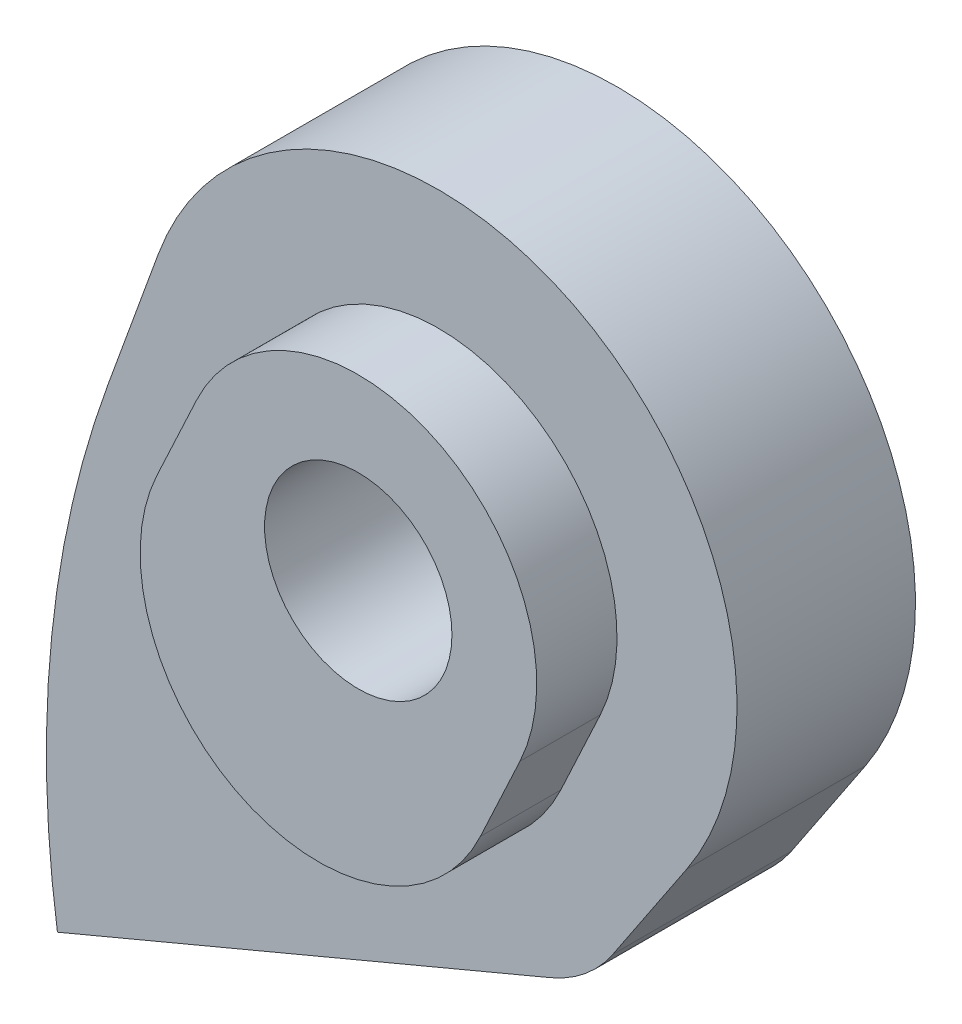
ISO-10303-21;
HEADER;
FILE_DESCRIPTION(('STEP AP214'),'2;1');
FILE_NAME('part.step','',(''),(''),'','','');
FILE_SCHEMA(('AUTOMOTIVE_DESIGN { 1 0 10303 214 1 1 1 1 }'));
ENDSEC;
DATA;
#1=APPLICATION_CONTEXT('core data for automotive mechanical design processes');
#2=APPLICATION_PROTOCOL_DEFINITION('international standard','automotive_design',2000,#1);
#3=PRODUCT_CONTEXT('',#1,'mechanical');
#4=PRODUCT('Part','Part','',(#3));
#5=PRODUCT_RELATED_PRODUCT_CATEGORY('part','',(#4));
#6=PRODUCT_DEFINITION_FORMATION('','',#4);
#7=PRODUCT_DEFINITION_CONTEXT('part definition',#1,'design');
#8=PRODUCT_DEFINITION('design','',#6,#7);
#9=PRODUCT_DEFINITION_SHAPE('','',#8);
#10=(LENGTH_UNIT() NAMED_UNIT(*) SI_UNIT(.MILLI.,.METRE.));
#11=(NAMED_UNIT(*) PLANE_ANGLE_UNIT() SI_UNIT($,.RADIAN.));
#12=(NAMED_UNIT(*) SI_UNIT($,.STERADIAN.) SOLID_ANGLE_UNIT());
#13=UNCERTAINTY_MEASURE_WITH_UNIT(LENGTH_MEASURE(1.E-05),#10,'distance_accuracy_value','');
#14=(GEOMETRIC_REPRESENTATION_CONTEXT(3) GLOBAL_UNCERTAINTY_ASSIGNED_CONTEXT((#13)) GLOBAL_UNIT_ASSIGNED_CONTEXT((#10,
#11,#12)) REPRESENTATION_CONTEXT('',''));
#15=CARTESIAN_POINT('',(0.,0.,0.));
#16=DIRECTION('',(0.,0.,1.));
#17=DIRECTION('',(1.,0.,0.));
#18=AXIS2_PLACEMENT_3D('',#15,#16,#17);
#19=CARTESIAN_POINT('',(0.11468761398859,80.1325343968941,0.));
#20=DIRECTION('',(0.,0.,1.));
#21=DIRECTION('',(1.,0.,0.));
#22=AXIS2_PLACEMENT_3D('',#19,#20,#21);
#23=PLANE('',#22);
#24=CARTESIAN_POINT('',(14.2795120747355,71.4970986035797,0.));
#25=DIRECTION('',(0.,0.,1.));
#26=DIRECTION('',(1.,0.,0.));
#27=AXIS2_PLACEMENT_3D('',#24,#25,#26);
#28=CIRCLE('',#27,22.9540740082007);
#29=CARTESIAN_POINT('',(-7.29026188774433,79.3478542857725,0.));
#30=VERTEX_POINT('',#29);
#31=CARTESIAN_POINT('',(-8.42769677737512,68.1396919078421,0.));
#32=VERTEX_POINT('',#31);
#33=EDGE_CURVE('E154',#30,#32,#28,.T.);
#34=ORIENTED_EDGE('',*,*,#33,.T.);
#35=DIRECTION('',(-0.921960246209325,-0.387284526426812,0.));
#36=VECTOR('',#35,1.);
#37=CARTESIAN_POINT('',(2.62584420432856,72.7829131335289,0.));
#38=LINE('',#37,#36);
#39=CARTESIAN_POINT('',(2.62584420432857,72.7829131335288,0.));
#40=VERTEX_POINT('',#39);
#41=EDGE_CURVE('E178',#40,#32,#38,.T.);
#42=ORIENTED_EDGE('',*,*,#41,.F.);
#43=CARTESIAN_POINT('',(1.41064938117233,75.6757767567832,0.));
#44=DIRECTION('',(0.,0.,-1.));
#45=DIRECTION('',(-1.,0.,0.));
#46=AXIS2_PLACEMENT_3D('',#43,#44,#45);
#47=CIRCLE('',#46,3.13773140994799);
#48=CARTESIAN_POINT('',(4.02035151590427,73.933705240183,0.));
#49=VERTEX_POINT('',#48);
#50=EDGE_CURVE('E173',#49,#40,#47,.T.);
#51=ORIENTED_EDGE('',*,*,#50,.F.);
#52=DIRECTION('',(0.555200968150768,0.831716228628761,0.));
#53=VECTOR('',#52,1.);
#54=CARTESIAN_POINT('',(4.02035151590429,73.933705240183,0.));
#55=LINE('',#54,#53);
#56=CARTESIAN_POINT('',(5.67886918351501,76.4182399199654,0.));
#57=VERTEX_POINT('',#56);
#58=EDGE_CURVE('E147',#49,#57,#55,.T.);
#59=ORIENTED_EDGE('',*,*,#58,.T.);
#60=CARTESIAN_POINT('',(0.11468761398859,80.1325343968941,0.));
#61=DIRECTION('',(0.,0.,1.));
#62=DIRECTION('',(1.,0.,0.));
#63=AXIS2_PLACEMENT_3D('',#60,#61,#62);
#64=CIRCLE('',#63,6.69000000000006);
#65=CARTESIAN_POINT('',(-6.17185601906935,82.4206491557424,0.));
#66=VERTEX_POINT('',#65);
#67=EDGE_CURVE('E149',#57,#66,#64,.T.);
#68=ORIENTED_EDGE('',*,*,#67,.T.);
#69=DIRECTION('',(-0.342020143325666,-0.939692620785909,0.));
#70=VECTOR('',#69,1.);
#71=CARTESIAN_POINT('',(-6.1718560190694,82.4206491557424,0.));
#72=LINE('',#71,#70);
#73=EDGE_CURVE('E155',#66,#30,#72,.T.);
#74=ORIENTED_EDGE('',*,*,#73,.T.);
#75=EDGE_LOOP('',(#34,#42,#51,#59,#68,#74));
#76=FACE_BOUND('',#75,.T.);
#77=DIRECTION('',(-0.4226182617407,-0.90630778703665,0.));
#78=VECTOR('',#77,1.);
#79=CARTESIAN_POINT('',(-3.51054353415801,81.8230074438569,0.));
#80=LINE('',#79,#78);
#81=CARTESIAN_POINT('',(-3.51054353415801,81.8230074438569,0.));
#82=VERTEX_POINT('',#81);
#83=CARTESIAN_POINT('',(-4.39804188381347,79.9197610910799,0.));
#84=VERTEX_POINT('',#83);
#85=EDGE_CURVE('E241',#82,#84,#80,.T.);
#86=ORIENTED_EDGE('',*,*,#85,.F.);
#87=CARTESIAN_POINT('',(0.114687613988609,80.1325343968941,0.));
#88=DIRECTION('',(0.,0.,1.));
#89=DIRECTION('',(1.,0.,0.));
#90=AXIS2_PLACEMENT_3D('',#87,#88,#89);
#91=CIRCLE('',#90,4.00000000000001);
#92=CARTESIAN_POINT('',(3.73991876213519,78.4420613499313,0.));
#93=VERTEX_POINT('',#92);
#94=EDGE_CURVE('E145',#93,#82,#91,.T.);
#95=ORIENTED_EDGE('',*,*,#94,.F.);
#96=DIRECTION('',(0.4226182617407,0.90630778703665,0.));
#97=VECTOR('',#96,1.);
#98=CARTESIAN_POINT('',(3.73991876213519,78.4420613499313,0.));
#99=LINE('',#98,#97);
#100=CARTESIAN_POINT('',(2.85242041247973,76.5388149971543,0.));
#101=VERTEX_POINT('',#100);
#102=EDGE_CURVE('E141',#101,#93,#99,.T.);
#103=ORIENTED_EDGE('',*,*,#102,.F.);
#104=CARTESIAN_POINT('',(-0.772810735666862,78.2292880441171,0.));
#105=DIRECTION('',(0.,0.,1.));
#106=DIRECTION('',(1.,0.,0.));
#107=AXIS2_PLACEMENT_3D('',#104,#105,#106);
#108=CIRCLE('',#107,4.00000000000001);
#109=EDGE_CURVE('E243',#84,#101,#108,.T.);
#110=ORIENTED_EDGE('',*,*,#109,.F.);
#111=EDGE_LOOP('',(#86,#95,#103,#110));
#112=FACE_BOUND('',#111,.T.);
#113=ADVANCED_FACE('F33',(#76,#112),#23,.T.);
#114=CARTESIAN_POINT('',(-8.01359795678153,76.9658058271043,-7.));
#115=DIRECTION('',(-0.921960246209324,-0.387284526426815,0.));
#116=DIRECTION('',(0.387284526426815,-0.921960246209324,0.));
#117=AXIS2_PLACEMENT_3D('',#114,#115,#116);
#118=PLANE('',#117);
#119=DIRECTION('',(0.387284526426815,-0.921960246209324,0.));
#120=VECTOR('',#119,1.);
#121=CARTESIAN_POINT('',(-8.01359795678153,76.9658058271043,-4.));
#122=LINE('',#121,#120);
#123=CARTESIAN_POINT('',(-8.01359795678153,76.9658058271043,-4.));
#124=VERTEX_POINT('',#123);
#125=CARTESIAN_POINT('',(-4.92424784177968,69.611373108264,-4.));
#126=VERTEX_POINT('',#125);
#127=EDGE_CURVE('E56',#124,#126,#122,.T.);
#128=ORIENTED_EDGE('',*,*,#127,.T.);
#129=DIRECTION('',(0.,0.,1.));
#130=VECTOR('',#129,1.);
#131=CARTESIAN_POINT('',(-4.92424784177968,69.611373108264,-7.));
#132=LINE('',#131,#130);
#133=CARTESIAN_POINT('',(-4.92424784177968,69.611373108264,-7.));
#134=VERTEX_POINT('',#133);
#135=EDGE_CURVE('E166',#134,#126,#132,.T.);
#136=ORIENTED_EDGE('',*,*,#135,.F.);
#137=DIRECTION('',(0.387284526426815,-0.921960246209324,0.));
#138=VECTOR('',#137,1.);
#139=CARTESIAN_POINT('',(-8.01359795678153,76.9658058271043,-7.));
#140=LINE('',#139,#138);
#141=CARTESIAN_POINT('',(-8.01359795678153,76.9658058271043,-7.));
#142=VERTEX_POINT('',#141);
#143=EDGE_CURVE('E164',#142,#134,#140,.T.);
#144=ORIENTED_EDGE('',*,*,#143,.F.);
#145=DIRECTION('',(0.,0.,1.));
#146=VECTOR('',#145,1.);
#147=CARTESIAN_POINT('',(-8.01359795678153,76.9658058271043,-7.));
#148=LINE('',#147,#146);
#149=EDGE_CURVE('E170',#142,#124,#148,.T.);
#150=ORIENTED_EDGE('',*,*,#149,.T.);
#151=EDGE_LOOP('',(#128,#136,#144,#150));
#152=FACE_BOUND('',#151,.T.);
#153=ADVANCED_FACE('F230',(#152),#118,.F.);
#154=CARTESIAN_POINT('',(14.2795120747355,71.4970986035797,-7.));
#155=DIRECTION('',(0.,0.,1.));
#156=DIRECTION('',(1.,0.,0.));
#157=AXIS2_PLACEMENT_3D('',#154,#155,#156);
#158=PLANE('',#157);
#159=DIRECTION('',(-0.921960246209326,-0.38728452642681,0.));
#160=VECTOR('',#159,1.);
#161=CARTESIAN_POINT('',(-4.92424784177968,69.611373108264,-7.));
#162=LINE('',#161,#160);
#163=CARTESIAN_POINT('',(-8.42769677737511,68.1396919078421,-7.));
#164=VERTEX_POINT('',#163);
#165=EDGE_CURVE('E159',#134,#164,#162,.T.);
#166=ORIENTED_EDGE('',*,*,#165,.T.);
#167=CARTESIAN_POINT('',(14.2795120747355,71.4970986035797,-7.));
#168=DIRECTION('',(0.,0.,-1.));
#169=DIRECTION('',(1.,0.,0.));
#170=AXIS2_PLACEMENT_3D('',#167,#168,#169);
#171=CIRCLE('',#170,22.9540740082007);
#172=EDGE_CURVE('E162',#164,#142,#171,.T.);
#173=ORIENTED_EDGE('',*,*,#172,.T.);
#174=ORIENTED_EDGE('',*,*,#143,.T.);
#175=EDGE_LOOP('',(#166,#173,#174));
#176=FACE_BOUND('',#175,.T.);
#177=ADVANCED_FACE('F281',(#176),#158,.F.);
#178=CARTESIAN_POINT('',(0.11468761398859,80.1325343968941,-4.));
#179=DIRECTION('',(0.,0.,1.));
#180=DIRECTION('',(1.,0.,0.));
#181=AXIS2_PLACEMENT_3D('',#178,#179,#180);
#182=PLANE('',#181);
#183=CARTESIAN_POINT('',(0.11468761398859,80.1325343968941,-4.));
#184=DIRECTION('',(0.,0.,1.));
#185=DIRECTION('',(1.,0.,0.));
#186=AXIS2_PLACEMENT_3D('',#183,#184,#185);
#187=CIRCLE('',#186,2.10000000000001);
#188=CARTESIAN_POINT('',(2.2146876139886,80.1325343968941,-4.));
#189=VERTEX_POINT('',#188);
#190=EDGE_CURVE('E246',#189,#189,#187,.T.);
#191=ORIENTED_EDGE('',*,*,#190,.T.);
#192=EDGE_LOOP('',(#191));
#193=FACE_BOUND('',#192,.T.);
#194=ORIENTED_EDGE('',*,*,#127,.F.);
#195=CARTESIAN_POINT('',(14.2795120747355,71.4970986035797,-4.));
#196=DIRECTION('',(0.,0.,-1.));
#197=DIRECTION('',(-1.,0.,0.));
#198=AXIS2_PLACEMENT_3D('',#195,#196,#197);
#199=CIRCLE('',#198,22.9540740082007);
#200=CARTESIAN_POINT('',(-7.29026188774433,79.3478542857725,-4.));
#201=VERTEX_POINT('',#200);
#202=EDGE_CURVE('E184',#124,#201,#199,.T.);
#203=ORIENTED_EDGE('',*,*,#202,.T.);
#204=DIRECTION('',(0.342020143325687,0.939692620785902,0.));
#205=VECTOR('',#204,1.);
#206=CARTESIAN_POINT('',(-6.17185601906934,82.4206491557424,-4.));
#207=LINE('',#206,#205);
#208=CARTESIAN_POINT('',(-6.17185601906934,82.4206491557424,-4.));
#209=VERTEX_POINT('',#208);
#210=EDGE_CURVE('E186',#201,#209,#207,.T.);
#211=ORIENTED_EDGE('',*,*,#210,.T.);
#212=CARTESIAN_POINT('',(0.11468761398859,80.1325343968941,-4.));
#213=DIRECTION('',(0.,0.,-1.));
#214=DIRECTION('',(1.,0.,0.));
#215=AXIS2_PLACEMENT_3D('',#212,#213,#214);
#216=CIRCLE('',#215,6.69000000000002);
#217=CARTESIAN_POINT('',(5.67886918351501,76.4182399199654,-4.));
#218=VERTEX_POINT('',#217);
#219=EDGE_CURVE('E174',#209,#218,#216,.T.);
#220=ORIENTED_EDGE('',*,*,#219,.T.);
#221=DIRECTION('',(-0.555200968150769,-0.83171622862876,0.));
#222=VECTOR('',#221,1.);
#223=CARTESIAN_POINT('',(5.67886918351501,76.4182399199654,-4.));
#224=LINE('',#223,#222);
#225=CARTESIAN_POINT('',(4.02035151590429,73.933705240183,-4.));
#226=VERTEX_POINT('',#225);
#227=EDGE_CURVE('E177',#218,#226,#224,.T.);
#228=ORIENTED_EDGE('',*,*,#227,.T.);
#229=CARTESIAN_POINT('',(1.41064938117233,75.6757767567832,-4.));
#230=DIRECTION('',(0.,0.,-1.));
#231=DIRECTION('',(-1.,0.,0.));
#232=AXIS2_PLACEMENT_3D('',#229,#230,#231);
#233=CIRCLE('',#232,3.13773140994799);
#234=CARTESIAN_POINT('',(2.62584420432857,72.7829131335288,-4.));
#235=VERTEX_POINT('',#234);
#236=EDGE_CURVE('E180',#226,#235,#233,.T.);
#237=ORIENTED_EDGE('',*,*,#236,.T.);
#238=DIRECTION('',(-0.921960246209325,-0.387284526426812,0.));
#239=VECTOR('',#238,1.);
#240=CARTESIAN_POINT('',(2.62584420432856,72.7829131335289,-4.));
#241=LINE('',#240,#239);
#242=EDGE_CURVE('E182',#235,#126,#241,.T.);
#243=ORIENTED_EDGE('',*,*,#242,.T.);
#244=EDGE_LOOP('',(#194,#203,#211,#220,#228,#237,#243));
#245=FACE_BOUND('',#244,.T.);
#246=ADVANCED_FACE('F212',(#193,#245),#182,.F.);
#247=CARTESIAN_POINT('',(1.41064938117233,75.6757767567832,-4.));
#248=DIRECTION('',(0.,0.,1.));
#249=DIRECTION('',(1.,0.,0.));
#250=AXIS2_PLACEMENT_3D('',#247,#248,#249);
#251=CYLINDRICAL_SURFACE('',#250,3.13773140994799);
#252=ORIENTED_EDGE('',*,*,#50,.T.);
#253=DIRECTION('',(0.,0.,1.));
#254=VECTOR('',#253,1.);
#255=CARTESIAN_POINT('',(2.62584420432857,72.7829131335288,-4.));
#256=LINE('',#255,#254);
#257=EDGE_CURVE('E196',#235,#40,#256,.T.);
#258=ORIENTED_EDGE('',*,*,#257,.F.);
#259=ORIENTED_EDGE('',*,*,#236,.F.);
#260=DIRECTION('',(0.,0.,1.));
#261=VECTOR('',#260,1.);
#262=CARTESIAN_POINT('',(4.02035151590429,73.933705240183,-4.));
#263=LINE('',#262,#261);
#264=EDGE_CURVE('E199',#226,#49,#263,.T.);
#265=ORIENTED_EDGE('',*,*,#264,.T.);
#266=EDGE_LOOP('',(#252,#258,#259,#265));
#267=FACE_BOUND('',#266,.T.);
#268=ADVANCED_FACE('F223',(#267),#251,.T.);
#269=CARTESIAN_POINT('',(2.62584420432856,72.7829131335289,-4.));
#270=DIRECTION('',(-0.387284526426812,0.921960246209325,0.));
#271=DIRECTION('',(-0.921960246209325,-0.387284526426812,0.));
#272=AXIS2_PLACEMENT_3D('',#269,#270,#271);
#273=PLANE('',#272);
#274=ORIENTED_EDGE('',*,*,#41,.T.);
#275=DIRECTION('',(0.,0.,1.));
#276=VECTOR('',#275,1.);
#277=CARTESIAN_POINT('',(-8.42769677737511,68.1396919078421,-4.));
#278=LINE('',#277,#276);
#279=EDGE_CURVE('E189',#164,#32,#278,.T.);
#280=ORIENTED_EDGE('',*,*,#279,.F.);
#281=ORIENTED_EDGE('',*,*,#165,.F.);
#282=ORIENTED_EDGE('',*,*,#135,.T.);
#283=ORIENTED_EDGE('',*,*,#242,.F.);
#284=ORIENTED_EDGE('',*,*,#257,.T.);
#285=EDGE_LOOP('',(#274,#280,#281,#282,#283,#284));
#286=FACE_BOUND('',#285,.T.);
#287=ADVANCED_FACE('F225',(#286),#273,.F.);
#288=CARTESIAN_POINT('',(14.2795120747355,71.4970986035797,11.));
#289=DIRECTION('',(0.,0.,-1.));
#290=DIRECTION('',(-1.,0.,0.));
#291=AXIS2_PLACEMENT_3D('',#288,#289,#290);
#292=CYLINDRICAL_SURFACE('',#291,22.9540740082007);
#293=ORIENTED_EDGE('',*,*,#33,.F.);
#294=DIRECTION('',(0.,0.,-1.));
#295=VECTOR('',#294,1.);
#296=CARTESIAN_POINT('',(-7.29026188774433,79.3478542857725,11.));
#297=LINE('',#296,#295);
#298=EDGE_CURVE('E202',#30,#201,#297,.T.);
#299=ORIENTED_EDGE('',*,*,#298,.T.);
#300=ORIENTED_EDGE('',*,*,#202,.F.);
#301=ORIENTED_EDGE('',*,*,#149,.F.);
#302=ORIENTED_EDGE('',*,*,#172,.F.);
#303=ORIENTED_EDGE('',*,*,#279,.T.);
#304=EDGE_LOOP('',(#293,#299,#300,#301,#302,#303));
#305=FACE_BOUND('',#304,.T.);
#306=ADVANCED_FACE('F235',(#305),#292,.T.);
#307=CARTESIAN_POINT('',(-6.1718560190694,82.4206491557424,11.));
#308=DIRECTION('',(0.939692620785909,-0.342020143325666,0.));
#309=DIRECTION('',(0.342020143325666,0.939692620785909,0.));
#310=AXIS2_PLACEMENT_3D('',#307,#308,#309);
#311=PLANE('',#310);
#312=ORIENTED_EDGE('',*,*,#73,.F.);
#313=DIRECTION('',(0.,0.,-1.));
#314=VECTOR('',#313,1.);
#315=CARTESIAN_POINT('',(-6.17185601906935,82.4206491557424,11.));
#316=LINE('',#315,#314);
#317=EDGE_CURVE('E41',#66,#209,#316,.T.);
#318=ORIENTED_EDGE('',*,*,#317,.T.);
#319=ORIENTED_EDGE('',*,*,#210,.F.);
#320=ORIENTED_EDGE('',*,*,#298,.F.);
#321=EDGE_LOOP('',(#312,#318,#319,#320));
#322=FACE_BOUND('',#321,.T.);
#323=ADVANCED_FACE('F207',(#322),#311,.F.);
#324=CARTESIAN_POINT('',(0.11468761398859,80.1325343968941,11.));
#325=DIRECTION('',(0.,0.,-1.));
#326=DIRECTION('',(-1.,0.,0.));
#327=AXIS2_PLACEMENT_3D('',#324,#325,#326);
#328=CYLINDRICAL_SURFACE('',#327,6.69000000000006);
#329=ORIENTED_EDGE('',*,*,#317,.F.);
#330=ORIENTED_EDGE('',*,*,#67,.F.);
#331=DIRECTION('',(0.,0.,-1.));
#332=VECTOR('',#331,1.);
#333=CARTESIAN_POINT('',(5.67886918351501,76.4182399199654,11.));
#334=LINE('',#333,#332);
#335=EDGE_CURVE('E11',#57,#218,#334,.T.);
#336=ORIENTED_EDGE('',*,*,#335,.T.);
#337=ORIENTED_EDGE('',*,*,#219,.F.);
#338=EDGE_LOOP('',(#329,#330,#336,#337));
#339=FACE_BOUND('',#338,.T.);
#340=ADVANCED_FACE('F213',(#339),#328,.T.);
#341=CARTESIAN_POINT('',(4.02035151590429,73.933705240183,11.));
#342=DIRECTION('',(-0.831716228628761,0.555200968150768,0.));
#343=DIRECTION('',(-0.555200968150768,-0.831716228628761,0.));
#344=AXIS2_PLACEMENT_3D('',#341,#342,#343);
#345=PLANE('',#344);
#346=ORIENTED_EDGE('',*,*,#58,.F.);
#347=ORIENTED_EDGE('',*,*,#264,.F.);
#348=ORIENTED_EDGE('',*,*,#227,.F.);
#349=ORIENTED_EDGE('',*,*,#335,.F.);
#350=EDGE_LOOP('',(#346,#347,#348,#349));
#351=FACE_BOUND('',#350,.T.);
#352=ADVANCED_FACE('F35',(#351),#345,.F.);
#353=CARTESIAN_POINT('',(0.114687613988609,80.1325343968941,1.8));
#354=DIRECTION('',(0.,0.,-1.));
#355=DIRECTION('',(-1.,0.,0.));
#356=AXIS2_PLACEMENT_3D('',#353,#354,#355);
#357=CYLINDRICAL_SURFACE('',#356,4.00000000000001);
#358=ORIENTED_EDGE('',*,*,#94,.T.);
#359=DIRECTION('',(0.,0.,-1.));
#360=VECTOR('',#359,1.);
#361=CARTESIAN_POINT('',(-3.51054353415801,81.8230074438569,1.8));
#362=LINE('',#361,#360);
#363=CARTESIAN_POINT('',(-3.51054353415801,81.8230074438569,1.8));
#364=VERTEX_POINT('',#363);
#365=EDGE_CURVE('E126',#364,#82,#362,.T.);
#366=ORIENTED_EDGE('',*,*,#365,.F.);
#367=CARTESIAN_POINT('',(0.114687613988609,80.1325343968941,1.8));
#368=DIRECTION('',(0.,0.,1.));
#369=DIRECTION('',(1.,0.,0.));
#370=AXIS2_PLACEMENT_3D('',#367,#368,#369);
#371=CIRCLE('',#370,4.00000000000001);
#372=CARTESIAN_POINT('',(3.73991876213519,78.4420613499313,1.8));
#373=VERTEX_POINT('',#372);
#374=EDGE_CURVE('E133',#373,#364,#371,.T.);
#375=ORIENTED_EDGE('',*,*,#374,.F.);
#376=DIRECTION('',(0.,0.,-1.));
#377=VECTOR('',#376,1.);
#378=CARTESIAN_POINT('',(3.73991876213519,78.4420613499313,1.8));
#379=LINE('',#378,#377);
#380=EDGE_CURVE('E251',#373,#93,#379,.T.);
#381=ORIENTED_EDGE('',*,*,#380,.T.);
#382=EDGE_LOOP('',(#358,#366,#375,#381));
#383=FACE_BOUND('',#382,.T.);
#384=ADVANCED_FACE('F143',(#383),#357,.T.);
#385=CARTESIAN_POINT('',(-3.51054353415801,81.8230074438569,1.8));
#386=DIRECTION('',(0.90630778703665,-0.4226182617407,0.));
#387=DIRECTION('',(0.4226182617407,0.90630778703665,0.));
#388=AXIS2_PLACEMENT_3D('',#385,#386,#387);
#389=PLANE('',#388);
#390=ORIENTED_EDGE('',*,*,#85,.T.);
#391=DIRECTION('',(0.,0.,-1.));
#392=VECTOR('',#391,1.);
#393=CARTESIAN_POINT('',(-4.39804188381347,79.9197610910799,1.8));
#394=LINE('',#393,#392);
#395=CARTESIAN_POINT('',(-4.39804188381347,79.9197610910799,1.8));
#396=VERTEX_POINT('',#395);
#397=EDGE_CURVE('E129',#396,#84,#394,.T.);
#398=ORIENTED_EDGE('',*,*,#397,.F.);
#399=DIRECTION('',(-0.4226182617407,-0.90630778703665,0.));
#400=VECTOR('',#399,1.);
#401=CARTESIAN_POINT('',(-3.51054353415801,81.8230074438569,1.8));
#402=LINE('',#401,#400);
#403=EDGE_CURVE('E122',#364,#396,#402,.T.);
#404=ORIENTED_EDGE('',*,*,#403,.F.);
#405=ORIENTED_EDGE('',*,*,#365,.T.);
#406=EDGE_LOOP('',(#390,#398,#404,#405));
#407=FACE_BOUND('',#406,.T.);
#408=ADVANCED_FACE('F124',(#407),#389,.F.);
#409=CARTESIAN_POINT('',(-0.772810735666862,78.2292880441171,1.8));
#410=DIRECTION('',(0.,0.,-1.));
#411=DIRECTION('',(-1.,0.,0.));
#412=AXIS2_PLACEMENT_3D('',#409,#410,#411);
#413=CYLINDRICAL_SURFACE('',#412,4.00000000000001);
#414=ORIENTED_EDGE('',*,*,#109,.T.);
#415=DIRECTION('',(0.,0.,-1.));
#416=VECTOR('',#415,1.);
#417=CARTESIAN_POINT('',(2.85242041247973,76.5388149971543,1.8));
#418=LINE('',#417,#416);
#419=CARTESIAN_POINT('',(2.85242041247973,76.5388149971543,1.8));
#420=VERTEX_POINT('',#419);
#421=EDGE_CURVE('E48',#420,#101,#418,.T.);
#422=ORIENTED_EDGE('',*,*,#421,.F.);
#423=CARTESIAN_POINT('',(-0.772810735666862,78.2292880441171,1.8));
#424=DIRECTION('',(0.,0.,1.));
#425=DIRECTION('',(1.,0.,0.));
#426=AXIS2_PLACEMENT_3D('',#423,#424,#425);
#427=CIRCLE('',#426,4.00000000000001);
#428=EDGE_CURVE('E132',#396,#420,#427,.T.);
#429=ORIENTED_EDGE('',*,*,#428,.F.);
#430=ORIENTED_EDGE('',*,*,#397,.T.);
#431=EDGE_LOOP('',(#414,#422,#429,#430));
#432=FACE_BOUND('',#431,.T.);
#433=ADVANCED_FACE('F271',(#432),#413,.T.);
#434=CARTESIAN_POINT('',(3.73991876213519,78.4420613499313,1.8));
#435=DIRECTION('',(-0.90630778703665,0.4226182617407,0.));
#436=DIRECTION('',(-0.4226182617407,-0.90630778703665,0.));
#437=AXIS2_PLACEMENT_3D('',#434,#435,#436);
#438=PLANE('',#437);
#439=ORIENTED_EDGE('',*,*,#102,.T.);
#440=ORIENTED_EDGE('',*,*,#380,.F.);
#441=DIRECTION('',(0.4226182617407,0.90630778703665,0.));
#442=VECTOR('',#441,1.);
#443=CARTESIAN_POINT('',(3.73991876213519,78.4420613499313,1.8));
#444=LINE('',#443,#442);
#445=EDGE_CURVE('E137',#420,#373,#444,.T.);
#446=ORIENTED_EDGE('',*,*,#445,.F.);
#447=ORIENTED_EDGE('',*,*,#421,.T.);
#448=EDGE_LOOP('',(#439,#440,#446,#447));
#449=FACE_BOUND('',#448,.T.);
#450=ADVANCED_FACE('F264',(#449),#438,.F.);
#451=CARTESIAN_POINT('',(0.114687613988609,80.1325343968941,1.8));
#452=DIRECTION('',(0.,0.,1.));
#453=DIRECTION('',(1.,0.,0.));
#454=AXIS2_PLACEMENT_3D('',#451,#452,#453);
#455=PLANE('',#454);
#456=CARTESIAN_POINT('',(0.11468761398859,80.1325343968941,1.8));
#457=DIRECTION('',(0.,0.,1.));
#458=DIRECTION('',(1.,0.,0.));
#459=AXIS2_PLACEMENT_3D('',#456,#457,#458);
#460=CIRCLE('',#459,2.10000000000001);
#461=CARTESIAN_POINT('',(2.2146876139886,80.1325343968941,1.8));
#462=VERTEX_POINT('',#461);
#463=EDGE_CURVE('E256',#462,#462,#460,.T.);
#464=ORIENTED_EDGE('',*,*,#463,.F.);
#465=EDGE_LOOP('',(#464));
#466=FACE_BOUND('',#465,.T.);
#467=ORIENTED_EDGE('',*,*,#374,.T.);
#468=ORIENTED_EDGE('',*,*,#403,.T.);
#469=ORIENTED_EDGE('',*,*,#428,.T.);
#470=ORIENTED_EDGE('',*,*,#445,.T.);
#471=EDGE_LOOP('',(#467,#468,#469,#470));
#472=FACE_BOUND('',#471,.T.);
#473=ADVANCED_FACE('F136',(#466,#472),#455,.T.);
#474=CARTESIAN_POINT('',(0.11468761398859,80.1325343968941,-7.));
#475=DIRECTION('',(0.,0.,1.));
#476=DIRECTION('',(1.,0.,0.));
#477=AXIS2_PLACEMENT_3D('',#474,#475,#476);
#478=CYLINDRICAL_SURFACE('',#477,2.10000000000001);
#479=ORIENTED_EDGE('',*,*,#463,.T.);
#480=EDGE_LOOP('',(#479));
#481=FACE_BOUND('',#480,.T.);
#482=ORIENTED_EDGE('',*,*,#190,.F.);
#483=EDGE_LOOP('',(#482));
#484=FACE_BOUND('',#483,.T.);
#485=ADVANCED_FACE('F260',(#481,#484),#478,.F.);
#486=CLOSED_SHELL('',(#113,#153,#177,#246,#268,#287,#306,#323,#340,#352,#384,#408,#433,#450,
#473,#485));
#487=MANIFOLD_SOLID_BREP('B2',#486);
#488=ADVANCED_BREP_SHAPE_REPRESENTATION('',(#18,#487),#14);
#489=SHAPE_DEFINITION_REPRESENTATION(#9,#488);
ENDSEC;
END-ISO-10303-21;
